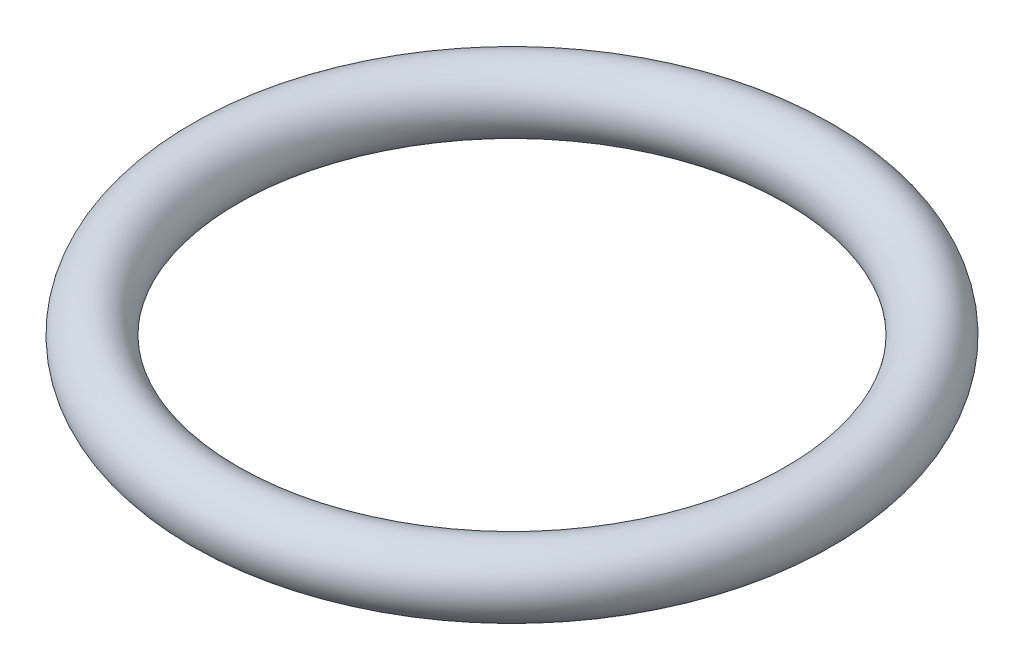
ISO-10303-21;
HEADER;
FILE_DESCRIPTION(('STEP AP214'),'2;1');
FILE_NAME('part.step','',(''),(''),'','','');
FILE_SCHEMA(('AUTOMOTIVE_DESIGN { 1 0 10303 214 1 1 1 1 }'));
ENDSEC;
DATA;
#1=APPLICATION_CONTEXT('core data for automotive mechanical design processes');
#2=APPLICATION_PROTOCOL_DEFINITION('international standard','automotive_design',2000,#1);
#3=PRODUCT_CONTEXT('',#1,'mechanical');
#4=PRODUCT('Part','Part','',(#3));
#5=PRODUCT_RELATED_PRODUCT_CATEGORY('part','',(#4));
#6=PRODUCT_DEFINITION_FORMATION('','',#4);
#7=PRODUCT_DEFINITION_CONTEXT('part definition',#1,'design');
#8=PRODUCT_DEFINITION('design','',#6,#7);
#9=PRODUCT_DEFINITION_SHAPE('','',#8);
#10=(LENGTH_UNIT() NAMED_UNIT(*) SI_UNIT(.MILLI.,.METRE.));
#11=(NAMED_UNIT(*) PLANE_ANGLE_UNIT() SI_UNIT($,.RADIAN.));
#12=(NAMED_UNIT(*) SI_UNIT($,.STERADIAN.) SOLID_ANGLE_UNIT());
#13=UNCERTAINTY_MEASURE_WITH_UNIT(LENGTH_MEASURE(1.E-05),#10,'distance_accuracy_value','');
#14=(GEOMETRIC_REPRESENTATION_CONTEXT(3) GLOBAL_UNCERTAINTY_ASSIGNED_CONTEXT((#13)) GLOBAL_UNIT_ASSIGNED_CONTEXT((#10,
#11,#12)) REPRESENTATION_CONTEXT('',''));
#15=CARTESIAN_POINT('',(0.,0.,0.));
#16=DIRECTION('',(0.,0.,1.));
#17=DIRECTION('',(1.,0.,0.));
#18=AXIS2_PLACEMENT_3D('',#15,#16,#17);
#19=CARTESIAN_POINT('',(0.,0.,0.));
#20=DIRECTION('',(0.,1.,0.));
#21=DIRECTION('',(0.,0.,1.));
#22=AXIS2_PLACEMENT_3D('',#19,#20,#21);
#23=TOROIDAL_SURFACE('',#22,14.15,1.55);
#24=CARTESIAN_POINT('',(0.,0.,14.15));
#25=DIRECTION('',(1.,0.,0.));
#26=DIRECTION('',(0.,0.,-1.));
#27=AXIS2_PLACEMENT_3D('',#24,#25,#26);
#28=CIRCLE('',#27,1.55);
#29=CARTESIAN_POINT('',(0.,0.,15.7));
#30=VERTEX_POINT('',#29);
#31=EDGE_CURVE('E11',#30,#30,#28,.T.);
#32=CARTESIAN_POINT('',(0.,0.,0.));
#33=DIRECTION('',(0.,1.,0.));
#34=DIRECTION('',(0.,0.,1.));
#35=AXIS2_PLACEMENT_3D('',#32,#33,#34);
#36=CIRCLE('',#35,15.7);
#37=EDGE_CURVE('',#30,#30,#36,.T.);
#38=ORIENTED_EDGE('',*,*,#31,.T.);
#39=ORIENTED_EDGE('',*,*,#31,.F.);
#40=ORIENTED_EDGE('',*,*,#37,.T.);
#41=ORIENTED_EDGE('',*,*,#37,.F.);
#42=EDGE_LOOP('',(#38,#40,#39,#41));
#43=FACE_BOUND('',#42,.T.);
#44=ADVANCED_FACE('F61',(#43),#23,.T.);
#45=CLOSED_SHELL('',(#44));
#46=MANIFOLD_SOLID_BREP('B2',#45);
#47=ADVANCED_BREP_SHAPE_REPRESENTATION('',(#18,#46),#14);
#48=SHAPE_DEFINITION_REPRESENTATION(#9,#47);
ENDSEC;
END-ISO-10303-21;
